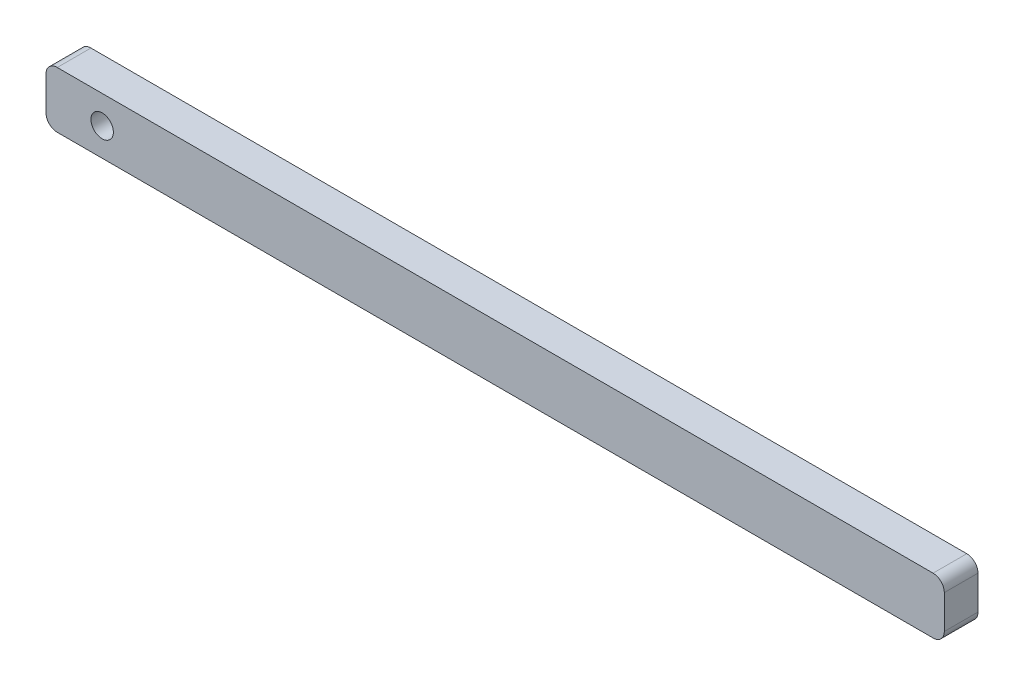
ISO-10303-21;
HEADER;
FILE_DESCRIPTION(('STEP AP214'),'2;1');
FILE_NAME('part.step','',(''),(''),'','','');
FILE_SCHEMA(('AUTOMOTIVE_DESIGN { 1 0 10303 214 1 1 1 1 }'));
ENDSEC;
DATA;
#1=APPLICATION_CONTEXT('core data for automotive mechanical design processes');
#2=APPLICATION_PROTOCOL_DEFINITION('international standard','automotive_design',2000,#1);
#3=PRODUCT_CONTEXT('',#1,'mechanical');
#4=PRODUCT('Part','Part','',(#3));
#5=PRODUCT_RELATED_PRODUCT_CATEGORY('part','',(#4));
#6=PRODUCT_DEFINITION_FORMATION('','',#4);
#7=PRODUCT_DEFINITION_CONTEXT('part definition',#1,'design');
#8=PRODUCT_DEFINITION('design','',#6,#7);
#9=PRODUCT_DEFINITION_SHAPE('','',#8);
#10=(LENGTH_UNIT() NAMED_UNIT(*) SI_UNIT(.MILLI.,.METRE.));
#11=(NAMED_UNIT(*) PLANE_ANGLE_UNIT() SI_UNIT($,.RADIAN.));
#12=(NAMED_UNIT(*) SI_UNIT($,.STERADIAN.) SOLID_ANGLE_UNIT());
#13=UNCERTAINTY_MEASURE_WITH_UNIT(LENGTH_MEASURE(1.E-05),#10,'distance_accuracy_value','');
#14=(GEOMETRIC_REPRESENTATION_CONTEXT(3) GLOBAL_UNCERTAINTY_ASSIGNED_CONTEXT((#13)) GLOBAL_UNIT_ASSIGNED_CONTEXT((#10,
#11,#12)) REPRESENTATION_CONTEXT('',''));
#15=CARTESIAN_POINT('',(0.,0.,0.));
#16=DIRECTION('',(0.,0.,1.));
#17=DIRECTION('',(1.,0.,0.));
#18=AXIS2_PLACEMENT_3D('',#15,#16,#17);
#19=CARTESIAN_POINT('',(-40.,2.5,3.));
#20=DIRECTION('',(1.,0.,0.));
#21=DIRECTION('',(0.,0.,-1.));
#22=AXIS2_PLACEMENT_3D('',#19,#20,#21);
#23=PLANE('',#22);
#24=DIRECTION('',(0.,-1.,0.));
#25=VECTOR('',#24,1.);
#26=CARTESIAN_POINT('',(-40.,2.5,0.));
#27=LINE('',#26,#25);
#28=CARTESIAN_POINT('',(-40.,1.5,0.));
#29=VERTEX_POINT('',#28);
#30=CARTESIAN_POINT('',(-40.,-1.5,0.));
#31=VERTEX_POINT('',#30);
#32=EDGE_CURVE('E138',#29,#31,#27,.T.);
#33=ORIENTED_EDGE('',*,*,#32,.T.);
#34=DIRECTION('',(0.,0.,-1.));
#35=VECTOR('',#34,1.);
#36=CARTESIAN_POINT('',(-40.,-1.5,3.));
#37=LINE('',#36,#35);
#38=CARTESIAN_POINT('',(-40.,-1.5,3.));
#39=VERTEX_POINT('',#38);
#40=EDGE_CURVE('E112',#31,#39,#37,.F.);
#41=ORIENTED_EDGE('',*,*,#40,.T.);
#42=DIRECTION('',(0.,-1.,0.));
#43=VECTOR('',#42,1.);
#44=CARTESIAN_POINT('',(-40.,2.5,3.));
#45=LINE('',#44,#43);
#46=CARTESIAN_POINT('',(-40.,1.5,3.));
#47=VERTEX_POINT('',#46);
#48=EDGE_CURVE('E151',#47,#39,#45,.T.);
#49=ORIENTED_EDGE('',*,*,#48,.F.);
#50=DIRECTION('',(0.,0.,-1.));
#51=VECTOR('',#50,1.);
#52=CARTESIAN_POINT('',(-40.,1.5,3.));
#53=LINE('',#52,#51);
#54=EDGE_CURVE('E118',#47,#29,#53,.T.);
#55=ORIENTED_EDGE('',*,*,#54,.T.);
#56=EDGE_LOOP('',(#33,#41,#49,#55));
#57=FACE_BOUND('',#56,.T.);
#58=ADVANCED_FACE('F39',(#57),#23,.F.);
#59=CARTESIAN_POINT('',(40.,-2.49999999999999,3.));
#60=DIRECTION('',(0.,1.,0.));
#61=DIRECTION('',(-1.,0.,0.));
#62=AXIS2_PLACEMENT_3D('',#59,#60,#61);
#63=PLANE('',#62);
#64=DIRECTION('',(1.,0.,0.));
#65=VECTOR('',#64,1.);
#66=CARTESIAN_POINT('',(40.,-2.49999999999999,3.));
#67=LINE('',#66,#65);
#68=CARTESIAN_POINT('',(-39.,-2.5,3.));
#69=VERTEX_POINT('',#68);
#70=CARTESIAN_POINT('',(39.,-2.49999999999999,3.));
#71=VERTEX_POINT('',#70);
#72=EDGE_CURVE('E128',#69,#71,#67,.T.);
#73=ORIENTED_EDGE('',*,*,#72,.F.);
#74=DIRECTION('',(0.,0.,-1.));
#75=VECTOR('',#74,1.);
#76=CARTESIAN_POINT('',(-39.,-2.5,3.));
#77=LINE('',#76,#75);
#78=CARTESIAN_POINT('',(-39.,-2.5,0.));
#79=VERTEX_POINT('',#78);
#80=EDGE_CURVE('E111',#69,#79,#77,.T.);
#81=ORIENTED_EDGE('',*,*,#80,.T.);
#82=DIRECTION('',(1.,0.,0.));
#83=VECTOR('',#82,1.);
#84=CARTESIAN_POINT('',(40.,-2.49999999999999,0.));
#85=LINE('',#84,#83);
#86=CARTESIAN_POINT('',(39.,-2.49999999999999,0.));
#87=VERTEX_POINT('',#86);
#88=EDGE_CURVE('E125',#79,#87,#85,.T.);
#89=ORIENTED_EDGE('',*,*,#88,.T.);
#90=DIRECTION('',(0.,0.,-1.));
#91=VECTOR('',#90,1.);
#92=CARTESIAN_POINT('',(39.,-2.49999999999999,3.));
#93=LINE('',#92,#91);
#94=EDGE_CURVE('E131',#87,#71,#93,.F.);
#95=ORIENTED_EDGE('',*,*,#94,.T.);
#96=EDGE_LOOP('',(#73,#81,#89,#95));
#97=FACE_BOUND('',#96,.T.);
#98=ADVANCED_FACE('F124',(#97),#63,.F.);
#99=CARTESIAN_POINT('',(40.,2.50000000000001,3.));
#100=DIRECTION('',(-1.,0.,0.));
#101=DIRECTION('',(0.,0.,1.));
#102=AXIS2_PLACEMENT_3D('',#99,#100,#101);
#103=PLANE('',#102);
#104=DIRECTION('',(0.,1.,0.));
#105=VECTOR('',#104,1.);
#106=CARTESIAN_POINT('',(40.,2.50000000000001,3.));
#107=LINE('',#106,#105);
#108=CARTESIAN_POINT('',(40.,-1.49999999999999,3.));
#109=VERTEX_POINT('',#108);
#110=CARTESIAN_POINT('',(40.,1.50000000000001,3.));
#111=VERTEX_POINT('',#110);
#112=EDGE_CURVE('E187',#109,#111,#107,.T.);
#113=ORIENTED_EDGE('',*,*,#112,.F.);
#114=DIRECTION('',(0.,0.,-1.));
#115=VECTOR('',#114,1.);
#116=CARTESIAN_POINT('',(40.,-1.49999999999999,3.));
#117=LINE('',#116,#115);
#118=CARTESIAN_POINT('',(40.,-1.49999999999999,0.));
#119=VERTEX_POINT('',#118);
#120=EDGE_CURVE('E11',#109,#119,#117,.T.);
#121=ORIENTED_EDGE('',*,*,#120,.T.);
#122=DIRECTION('',(0.,1.,0.));
#123=VECTOR('',#122,1.);
#124=CARTESIAN_POINT('',(40.,2.50000000000001,0.));
#125=LINE('',#124,#123);
#126=CARTESIAN_POINT('',(40.,1.50000000000001,0.));
#127=VERTEX_POINT('',#126);
#128=EDGE_CURVE('E137',#119,#127,#125,.T.);
#129=ORIENTED_EDGE('',*,*,#128,.T.);
#130=DIRECTION('',(0.,0.,-1.));
#131=VECTOR('',#130,1.);
#132=CARTESIAN_POINT('',(40.,1.50000000000001,3.));
#133=LINE('',#132,#131);
#134=EDGE_CURVE('E48',#127,#111,#133,.F.);
#135=ORIENTED_EDGE('',*,*,#134,.T.);
#136=EDGE_LOOP('',(#113,#121,#129,#135));
#137=FACE_BOUND('',#136,.T.);
#138=ADVANCED_FACE('F186',(#137),#103,.F.);
#139=CARTESIAN_POINT('',(40.,2.50000000000001,3.));
#140=DIRECTION('',(0.,-1.,0.));
#141=DIRECTION('',(1.,0.,0.));
#142=AXIS2_PLACEMENT_3D('',#139,#140,#141);
#143=PLANE('',#142);
#144=DIRECTION('',(-1.,0.,0.));
#145=VECTOR('',#144,1.);
#146=CARTESIAN_POINT('',(40.,2.50000000000001,0.));
#147=LINE('',#146,#145);
#148=CARTESIAN_POINT('',(39.,2.50000000000001,0.));
#149=VERTEX_POINT('',#148);
#150=CARTESIAN_POINT('',(-39.,2.5,0.));
#151=VERTEX_POINT('',#150);
#152=EDGE_CURVE('E143',#149,#151,#147,.T.);
#153=ORIENTED_EDGE('',*,*,#152,.T.);
#154=DIRECTION('',(0.,0.,-1.));
#155=VECTOR('',#154,1.);
#156=CARTESIAN_POINT('',(-39.,2.5,3.));
#157=LINE('',#156,#155);
#158=CARTESIAN_POINT('',(-39.,2.5,3.));
#159=VERTEX_POINT('',#158);
#160=EDGE_CURVE('E55',#151,#159,#157,.F.);
#161=ORIENTED_EDGE('',*,*,#160,.T.);
#162=DIRECTION('',(-1.,0.,0.));
#163=VECTOR('',#162,1.);
#164=CARTESIAN_POINT('',(40.,2.50000000000001,3.));
#165=LINE('',#164,#163);
#166=CARTESIAN_POINT('',(39.,2.50000000000001,3.));
#167=VERTEX_POINT('',#166);
#168=EDGE_CURVE('E153',#167,#159,#165,.T.);
#169=ORIENTED_EDGE('',*,*,#168,.F.);
#170=DIRECTION('',(0.,0.,-1.));
#171=VECTOR('',#170,1.);
#172=CARTESIAN_POINT('',(39.,2.50000000000001,3.));
#173=LINE('',#172,#171);
#174=EDGE_CURVE('E177',#167,#149,#173,.T.);
#175=ORIENTED_EDGE('',*,*,#174,.T.);
#176=EDGE_LOOP('',(#153,#161,#169,#175));
#177=FACE_BOUND('',#176,.T.);
#178=ADVANCED_FACE('F197',(#177),#143,.F.);
#179=CARTESIAN_POINT('',(0.,0.,3.));
#180=DIRECTION('',(0.,0.,-1.));
#181=DIRECTION('',(-1.,0.,0.));
#182=AXIS2_PLACEMENT_3D('',#179,#180,#181);
#183=PLANE('',#182);
#184=CARTESIAN_POINT('',(-35.,0.,3.));
#185=DIRECTION('',(0.,0.,1.));
#186=DIRECTION('',(1.,0.,0.));
#187=AXIS2_PLACEMENT_3D('',#184,#185,#186);
#188=CIRCLE('',#187,0.999999999999998);
#189=CARTESIAN_POINT('',(-34.,0.,3.));
#190=VERTEX_POINT('',#189);
#191=EDGE_CURVE('E209',#190,#190,#188,.T.);
#192=ORIENTED_EDGE('',*,*,#191,.F.);
#193=EDGE_LOOP('',(#192));
#194=FACE_BOUND('',#193,.T.);
#195=ORIENTED_EDGE('',*,*,#48,.T.);
#196=CARTESIAN_POINT('',(-39.,-1.5,3.));
#197=DIRECTION('',(0.,0.,-1.));
#198=DIRECTION('',(-1.,0.,0.));
#199=AXIS2_PLACEMENT_3D('',#196,#197,#198);
#200=CIRCLE('',#199,1.);
#201=EDGE_CURVE('E174',#39,#69,#200,.F.);
#202=ORIENTED_EDGE('',*,*,#201,.T.);
#203=ORIENTED_EDGE('',*,*,#72,.T.);
#204=CARTESIAN_POINT('',(39.,-1.49999999999999,3.));
#205=DIRECTION('',(0.,0.,-1.));
#206=DIRECTION('',(-1.,0.,0.));
#207=AXIS2_PLACEMENT_3D('',#204,#205,#206);
#208=CIRCLE('',#207,1.);
#209=EDGE_CURVE('E168',#71,#109,#208,.F.);
#210=ORIENTED_EDGE('',*,*,#209,.T.);
#211=ORIENTED_EDGE('',*,*,#112,.T.);
#212=CARTESIAN_POINT('',(39.,1.50000000000001,3.));
#213=DIRECTION('',(0.,0.,-1.));
#214=DIRECTION('',(-1.,0.,0.));
#215=AXIS2_PLACEMENT_3D('',#212,#213,#214);
#216=CIRCLE('',#215,1.);
#217=EDGE_CURVE('E62',#111,#167,#216,.F.);
#218=ORIENTED_EDGE('',*,*,#217,.T.);
#219=ORIENTED_EDGE('',*,*,#168,.T.);
#220=CARTESIAN_POINT('',(-39.,1.5,3.));
#221=DIRECTION('',(0.,0.,-1.));
#222=DIRECTION('',(-1.,0.,0.));
#223=AXIS2_PLACEMENT_3D('',#220,#221,#222);
#224=CIRCLE('',#223,1.);
#225=EDGE_CURVE('E171',#159,#47,#224,.F.);
#226=ORIENTED_EDGE('',*,*,#225,.T.);
#227=EDGE_LOOP('',(#195,#202,#203,#210,#211,#218,#219,#226));
#228=FACE_BOUND('',#227,.T.);
#229=ADVANCED_FACE('F191',(#194,#228),#183,.F.);
#230=CARTESIAN_POINT('',(0.,0.,0.));
#231=DIRECTION('',(0.,0.,-1.));
#232=DIRECTION('',(-1.,0.,0.));
#233=AXIS2_PLACEMENT_3D('',#230,#231,#232);
#234=PLANE('',#233);
#235=CARTESIAN_POINT('',(-35.,0.,0.));
#236=DIRECTION('',(0.,0.,1.));
#237=DIRECTION('',(1.,0.,0.));
#238=AXIS2_PLACEMENT_3D('',#235,#236,#237);
#239=CIRCLE('',#238,0.999999999999998);
#240=CARTESIAN_POINT('',(-34.,0.,0.));
#241=VERTEX_POINT('',#240);
#242=EDGE_CURVE('E145',#241,#241,#239,.T.);
#243=ORIENTED_EDGE('',*,*,#242,.T.);
#244=EDGE_LOOP('',(#243));
#245=FACE_BOUND('',#244,.T.);
#246=ORIENTED_EDGE('',*,*,#88,.F.);
#247=CARTESIAN_POINT('',(-39.,-1.5,0.));
#248=DIRECTION('',(0.,0.,-1.));
#249=DIRECTION('',(-1.,0.,0.));
#250=AXIS2_PLACEMENT_3D('',#247,#248,#249);
#251=CIRCLE('',#250,1.);
#252=EDGE_CURVE('E107',#79,#31,#251,.T.);
#253=ORIENTED_EDGE('',*,*,#252,.T.);
#254=ORIENTED_EDGE('',*,*,#32,.F.);
#255=CARTESIAN_POINT('',(-39.,1.5,0.));
#256=DIRECTION('',(0.,0.,-1.));
#257=DIRECTION('',(-1.,0.,0.));
#258=AXIS2_PLACEMENT_3D('',#255,#256,#257);
#259=CIRCLE('',#258,1.);
#260=EDGE_CURVE('E119',#29,#151,#259,.T.);
#261=ORIENTED_EDGE('',*,*,#260,.T.);
#262=ORIENTED_EDGE('',*,*,#152,.F.);
#263=CARTESIAN_POINT('',(39.,1.50000000000001,0.));
#264=DIRECTION('',(0.,0.,-1.));
#265=DIRECTION('',(-1.,0.,0.));
#266=AXIS2_PLACEMENT_3D('',#263,#264,#265);
#267=CIRCLE('',#266,1.);
#268=EDGE_CURVE('E130',#149,#127,#267,.T.);
#269=ORIENTED_EDGE('',*,*,#268,.T.);
#270=ORIENTED_EDGE('',*,*,#128,.F.);
#271=CARTESIAN_POINT('',(39.,-1.49999999999999,0.));
#272=DIRECTION('',(0.,0.,-1.));
#273=DIRECTION('',(-1.,0.,0.));
#274=AXIS2_PLACEMENT_3D('',#271,#272,#273);
#275=CIRCLE('',#274,1.);
#276=EDGE_CURVE('E135',#119,#87,#275,.T.);
#277=ORIENTED_EDGE('',*,*,#276,.T.);
#278=EDGE_LOOP('',(#246,#253,#254,#261,#262,#269,#270,#277));
#279=FACE_BOUND('',#278,.T.);
#280=ADVANCED_FACE('F133',(#245,#279),#234,.T.);
#281=CARTESIAN_POINT('',(-35.,0.,0.));
#282=DIRECTION('',(0.,0.,1.));
#283=DIRECTION('',(1.,0.,0.));
#284=AXIS2_PLACEMENT_3D('',#281,#282,#283);
#285=CYLINDRICAL_SURFACE('',#284,0.999999999999998);
#286=ORIENTED_EDGE('',*,*,#242,.F.);
#287=EDGE_LOOP('',(#286));
#288=FACE_BOUND('',#287,.T.);
#289=ORIENTED_EDGE('',*,*,#191,.T.);
#290=EDGE_LOOP('',(#289));
#291=FACE_BOUND('',#290,.T.);
#292=ADVANCED_FACE('F219',(#288,#291),#285,.F.);
#293=CARTESIAN_POINT('',(-39.,-1.5,3.));
#294=DIRECTION('',(0.,0.,-1.));
#295=DIRECTION('',(-1.,0.,0.));
#296=AXIS2_PLACEMENT_3D('',#293,#294,#295);
#297=CYLINDRICAL_SURFACE('',#296,1.);
#298=ORIENTED_EDGE('',*,*,#201,.F.);
#299=ORIENTED_EDGE('',*,*,#40,.F.);
#300=ORIENTED_EDGE('',*,*,#252,.F.);
#301=ORIENTED_EDGE('',*,*,#80,.F.);
#302=EDGE_LOOP('',(#298,#299,#300,#301));
#303=FACE_BOUND('',#302,.T.);
#304=ADVANCED_FACE('F110',(#303),#297,.T.);
#305=CARTESIAN_POINT('',(-39.,1.5,3.));
#306=DIRECTION('',(0.,0.,-1.));
#307=DIRECTION('',(-1.,0.,0.));
#308=AXIS2_PLACEMENT_3D('',#305,#306,#307);
#309=CYLINDRICAL_SURFACE('',#308,1.);
#310=ORIENTED_EDGE('',*,*,#225,.F.);
#311=ORIENTED_EDGE('',*,*,#160,.F.);
#312=ORIENTED_EDGE('',*,*,#260,.F.);
#313=ORIENTED_EDGE('',*,*,#54,.F.);
#314=EDGE_LOOP('',(#310,#311,#312,#313));
#315=FACE_BOUND('',#314,.T.);
#316=ADVANCED_FACE('F201',(#315),#309,.T.);
#317=CARTESIAN_POINT('',(39.,-1.49999999999999,3.));
#318=DIRECTION('',(0.,0.,-1.));
#319=DIRECTION('',(-1.,0.,0.));
#320=AXIS2_PLACEMENT_3D('',#317,#318,#319);
#321=CYLINDRICAL_SURFACE('',#320,1.);
#322=ORIENTED_EDGE('',*,*,#209,.F.);
#323=ORIENTED_EDGE('',*,*,#94,.F.);
#324=ORIENTED_EDGE('',*,*,#276,.F.);
#325=ORIENTED_EDGE('',*,*,#120,.F.);
#326=EDGE_LOOP('',(#322,#323,#324,#325));
#327=FACE_BOUND('',#326,.T.);
#328=ADVANCED_FACE('F244',(#327),#321,.T.);
#329=CARTESIAN_POINT('',(39.,1.50000000000001,3.));
#330=DIRECTION('',(0.,0.,-1.));
#331=DIRECTION('',(-1.,0.,0.));
#332=AXIS2_PLACEMENT_3D('',#329,#330,#331);
#333=CYLINDRICAL_SURFACE('',#332,1.);
#334=ORIENTED_EDGE('',*,*,#217,.F.);
#335=ORIENTED_EDGE('',*,*,#134,.F.);
#336=ORIENTED_EDGE('',*,*,#268,.F.);
#337=ORIENTED_EDGE('',*,*,#174,.F.);
#338=EDGE_LOOP('',(#334,#335,#336,#337));
#339=FACE_BOUND('',#338,.T.);
#340=ADVANCED_FACE('F41',(#339),#333,.T.);
#341=CLOSED_SHELL('',(#58,#98,#138,#178,#229,#280,#292,#304,#316,#328,#340));
#342=MANIFOLD_SOLID_BREP('B2',#341);
#343=ADVANCED_BREP_SHAPE_REPRESENTATION('',(#18,#342),#14);
#344=SHAPE_DEFINITION_REPRESENTATION(#9,#343);
ENDSEC;
END-ISO-10303-21;
